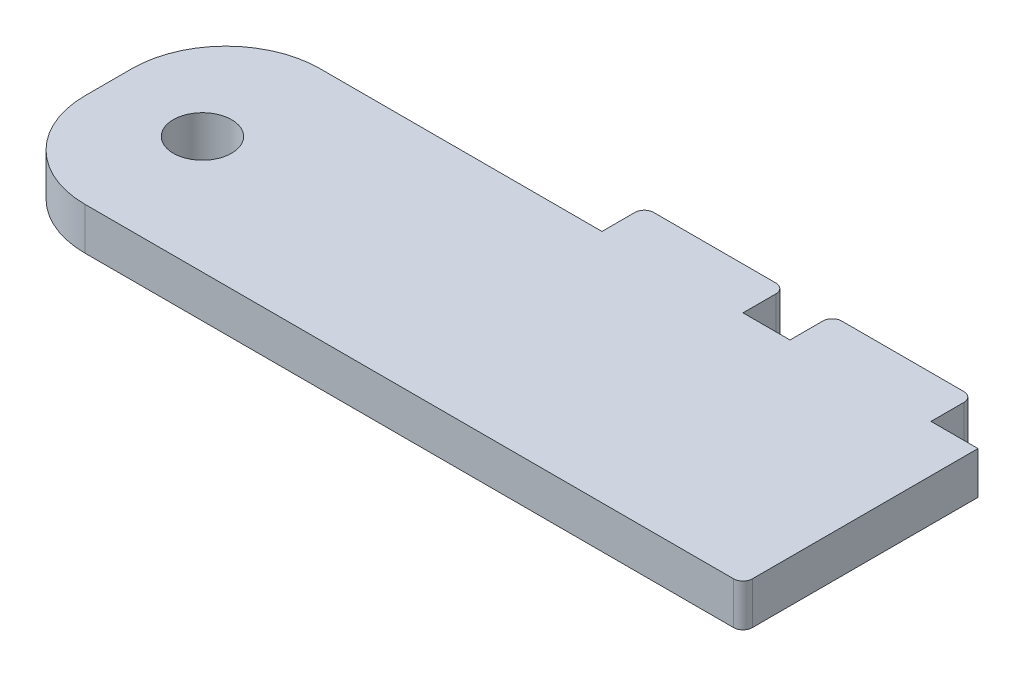
ISO-10303-21;
HEADER;
FILE_DESCRIPTION(('STEP AP214'),'2;1');
FILE_NAME('part.step','',(''),(''),'','','');
FILE_SCHEMA(('AUTOMOTIVE_DESIGN { 1 0 10303 214 1 1 1 1 }'));
ENDSEC;
DATA;
#1=APPLICATION_CONTEXT('core data for automotive mechanical design processes');
#2=APPLICATION_PROTOCOL_DEFINITION('international standard','automotive_design',2000,#1);
#3=PRODUCT_CONTEXT('',#1,'mechanical');
#4=PRODUCT('Part','Part','',(#3));
#5=PRODUCT_RELATED_PRODUCT_CATEGORY('part','',(#4));
#6=PRODUCT_DEFINITION_FORMATION('','',#4);
#7=PRODUCT_DEFINITION_CONTEXT('part definition',#1,'design');
#8=PRODUCT_DEFINITION('design','',#6,#7);
#9=PRODUCT_DEFINITION_SHAPE('','',#8);
#10=(LENGTH_UNIT() NAMED_UNIT(*) SI_UNIT(.MILLI.,.METRE.));
#11=(NAMED_UNIT(*) PLANE_ANGLE_UNIT() SI_UNIT($,.RADIAN.));
#12=(NAMED_UNIT(*) SI_UNIT($,.STERADIAN.) SOLID_ANGLE_UNIT());
#13=UNCERTAINTY_MEASURE_WITH_UNIT(LENGTH_MEASURE(1.E-05),#10,'distance_accuracy_value','');
#14=(GEOMETRIC_REPRESENTATION_CONTEXT(3) GLOBAL_UNCERTAINTY_ASSIGNED_CONTEXT((#13)) GLOBAL_UNIT_ASSIGNED_CONTEXT((#10,
#11,#12)) REPRESENTATION_CONTEXT('',''));
#15=CARTESIAN_POINT('',(0.,0.,0.));
#16=DIRECTION('',(0.,0.,1.));
#17=DIRECTION('',(1.,0.,0.));
#18=AXIS2_PLACEMENT_3D('',#15,#16,#17);
#19=CARTESIAN_POINT('',(39.,4.5,11.5));
#20=DIRECTION('',(0.,1.,0.));
#21=DIRECTION('',(0.,0.,1.));
#22=AXIS2_PLACEMENT_3D('',#19,#20,#21);
#23=PLANE('',#22);
#24=DIRECTION('',(-1.,0.,0.));
#25=VECTOR('',#24,1.);
#26=CARTESIAN_POINT('',(35.,4.5,-12.5));
#27=LINE('',#26,#25);
#28=CARTESIAN_POINT('',(40.,4.5,-12.5));
#29=VERTEX_POINT('',#28);
#30=CARTESIAN_POINT('',(35.,4.5,-12.5));
#31=VERTEX_POINT('',#30);
#32=EDGE_CURVE('E233',#29,#31,#27,.T.);
#33=ORIENTED_EDGE('',*,*,#32,.T.);
#34=DIRECTION('',(0.,0.,-1.));
#35=VECTOR('',#34,1.);
#36=CARTESIAN_POINT('',(35.,4.5,-12.5));
#37=LINE('',#36,#35);
#38=CARTESIAN_POINT('',(35.,4.5,-16.));
#39=VERTEX_POINT('',#38);
#40=EDGE_CURVE('E126',#31,#39,#37,.T.);
#41=ORIENTED_EDGE('',*,*,#40,.T.);
#42=CARTESIAN_POINT('',(34.,4.5,-16.));
#43=DIRECTION('',(0.,1.,0.));
#44=DIRECTION('',(0.,0.,-1.));
#45=AXIS2_PLACEMENT_3D('',#42,#43,#44);
#46=CIRCLE('',#45,1.);
#47=CARTESIAN_POINT('',(34.,4.5,-17.));
#48=VERTEX_POINT('',#47);
#49=EDGE_CURVE('E281',#39,#48,#46,.T.);
#50=ORIENTED_EDGE('',*,*,#49,.T.);
#51=DIRECTION('',(-1.,0.,0.));
#52=VECTOR('',#51,1.);
#53=CARTESIAN_POINT('',(21.,4.5,-17.));
#54=LINE('',#53,#52);
#55=CARTESIAN_POINT('',(21.,4.5,-17.));
#56=VERTEX_POINT('',#55);
#57=EDGE_CURVE('E300',#48,#56,#54,.T.);
#58=ORIENTED_EDGE('',*,*,#57,.T.);
#59=CARTESIAN_POINT('',(21.,4.5,-16.));
#60=DIRECTION('',(0.,1.,0.));
#61=DIRECTION('',(0.,0.,-1.));
#62=AXIS2_PLACEMENT_3D('',#59,#60,#61);
#63=CIRCLE('',#62,1.);
#64=CARTESIAN_POINT('',(20.,4.5,-16.));
#65=VERTEX_POINT('',#64);
#66=EDGE_CURVE('E297',#56,#65,#63,.T.);
#67=ORIENTED_EDGE('',*,*,#66,.T.);
#68=DIRECTION('',(0.,0.,1.));
#69=VECTOR('',#68,1.);
#70=CARTESIAN_POINT('',(20.,4.5,-12.5));
#71=LINE('',#70,#69);
#72=CARTESIAN_POINT('',(20.,4.5,-12.5));
#73=VERTEX_POINT('',#72);
#74=EDGE_CURVE('E299',#65,#73,#71,.T.);
#75=ORIENTED_EDGE('',*,*,#74,.T.);
#76=DIRECTION('',(-1.,0.,0.));
#77=VECTOR('',#76,1.);
#78=CARTESIAN_POINT('',(15.,4.5,-12.5));
#79=LINE('',#78,#77);
#80=CARTESIAN_POINT('',(15.,4.5,-12.5));
#81=VERTEX_POINT('',#80);
#82=EDGE_CURVE('E302',#73,#81,#79,.T.);
#83=ORIENTED_EDGE('',*,*,#82,.T.);
#84=DIRECTION('',(0.,0.,-1.));
#85=VECTOR('',#84,1.);
#86=CARTESIAN_POINT('',(15.,4.5,-12.5));
#87=LINE('',#86,#85);
#88=CARTESIAN_POINT('',(15.,4.5,-16.));
#89=VERTEX_POINT('',#88);
#90=EDGE_CURVE('E308',#81,#89,#87,.T.);
#91=ORIENTED_EDGE('',*,*,#90,.T.);
#92=CARTESIAN_POINT('',(14.,4.5,-16.));
#93=DIRECTION('',(0.,1.,0.));
#94=DIRECTION('',(0.,0.,-1.));
#95=AXIS2_PLACEMENT_3D('',#92,#93,#94);
#96=CIRCLE('',#95,1.);
#97=CARTESIAN_POINT('',(14.,4.5,-17.));
#98=VERTEX_POINT('',#97);
#99=EDGE_CURVE('E310',#89,#98,#96,.T.);
#100=ORIENTED_EDGE('',*,*,#99,.T.);
#101=DIRECTION('',(-1.,0.,0.));
#102=VECTOR('',#101,1.);
#103=CARTESIAN_POINT('',(0.999999999999993,4.5,-17.));
#104=LINE('',#103,#102);
#105=CARTESIAN_POINT('',(0.999999999999993,4.5,-17.));
#106=VERTEX_POINT('',#105);
#107=EDGE_CURVE('E312',#98,#106,#104,.T.);
#108=ORIENTED_EDGE('',*,*,#107,.T.);
#109=CARTESIAN_POINT('',(0.999999999999993,4.5,-16.));
#110=DIRECTION('',(0.,1.,0.));
#111=DIRECTION('',(0.,0.,-1.));
#112=AXIS2_PLACEMENT_3D('',#109,#110,#111);
#113=CIRCLE('',#112,1.);
#114=CARTESIAN_POINT('',(0.,4.5,-16.));
#115=VERTEX_POINT('',#114);
#116=EDGE_CURVE('E314',#106,#115,#113,.T.);
#117=ORIENTED_EDGE('',*,*,#116,.T.);
#118=DIRECTION('',(0.,0.,1.));
#119=VECTOR('',#118,1.);
#120=CARTESIAN_POINT('',(0.,4.5,-12.5));
#121=LINE('',#120,#119);
#122=CARTESIAN_POINT('',(0.,4.5,-12.5));
#123=VERTEX_POINT('',#122);
#124=EDGE_CURVE('E316',#115,#123,#121,.T.);
#125=ORIENTED_EDGE('',*,*,#124,.T.);
#126=DIRECTION('',(-1.,0.,0.));
#127=VECTOR('',#126,1.);
#128=CARTESIAN_POINT('',(-30.,4.5,-12.5));
#129=LINE('',#128,#127);
#130=CARTESIAN_POINT('',(-30.,4.5,-12.5));
#131=VERTEX_POINT('',#130);
#132=EDGE_CURVE('E318',#123,#131,#129,.T.);
#133=ORIENTED_EDGE('',*,*,#132,.T.);
#134=CARTESIAN_POINT('',(-30.,4.5,-2.5));
#135=DIRECTION('',(0.,1.,0.));
#136=DIRECTION('',(0.,0.,-1.));
#137=AXIS2_PLACEMENT_3D('',#134,#135,#136);
#138=CIRCLE('',#137,10.);
#139=CARTESIAN_POINT('',(-40.,4.5,-2.5));
#140=VERTEX_POINT('',#139);
#141=EDGE_CURVE('E320',#131,#140,#138,.T.);
#142=ORIENTED_EDGE('',*,*,#141,.T.);
#143=DIRECTION('',(0.,0.,1.));
#144=VECTOR('',#143,1.);
#145=CARTESIAN_POINT('',(-40.,4.5,2.5));
#146=LINE('',#145,#144);
#147=CARTESIAN_POINT('',(-40.,4.5,2.5));
#148=VERTEX_POINT('',#147);
#149=EDGE_CURVE('E322',#140,#148,#146,.T.);
#150=ORIENTED_EDGE('',*,*,#149,.T.);
#151=CARTESIAN_POINT('',(-30.,4.5,2.5));
#152=DIRECTION('',(0.,1.,0.));
#153=DIRECTION('',(0.,0.,-1.));
#154=AXIS2_PLACEMENT_3D('',#151,#152,#153);
#155=CIRCLE('',#154,10.);
#156=CARTESIAN_POINT('',(-30.,4.5,12.5));
#157=VERTEX_POINT('',#156);
#158=EDGE_CURVE('E178',#148,#157,#155,.T.);
#159=ORIENTED_EDGE('',*,*,#158,.T.);
#160=DIRECTION('',(1.,0.,0.));
#161=VECTOR('',#160,1.);
#162=CARTESIAN_POINT('',(-30.,4.5,12.5));
#163=LINE('',#162,#161);
#164=CARTESIAN_POINT('',(39.,4.5,12.5));
#165=VERTEX_POINT('',#164);
#166=EDGE_CURVE('E172',#157,#165,#163,.T.);
#167=ORIENTED_EDGE('',*,*,#166,.T.);
#168=CARTESIAN_POINT('',(39.,4.5,11.5));
#169=DIRECTION('',(0.,1.,0.));
#170=DIRECTION('',(0.,0.,1.));
#171=AXIS2_PLACEMENT_3D('',#168,#169,#170);
#172=CIRCLE('',#171,1.);
#173=CARTESIAN_POINT('',(40.,4.5,11.5));
#174=VERTEX_POINT('',#173);
#175=EDGE_CURVE('E176',#165,#174,#172,.T.);
#176=ORIENTED_EDGE('',*,*,#175,.T.);
#177=DIRECTION('',(0.,0.,-1.));
#178=VECTOR('',#177,1.);
#179=CARTESIAN_POINT('',(40.,4.5,11.5));
#180=LINE('',#179,#178);
#181=EDGE_CURVE('E50',#174,#29,#180,.T.);
#182=ORIENTED_EDGE('',*,*,#181,.T.);
#183=EDGE_LOOP('',(#33,#41,#50,#58,#67,#75,#83,#91,#100,#108,#117,#125,#133,#142,#150,#159,#167,
#176,#182));
#184=FACE_BOUND('',#183,.T.);
#185=CARTESIAN_POINT('',(-30.,4.5,0.));
#186=DIRECTION('',(0.,1.,0.));
#187=DIRECTION('',(0.,0.,1.));
#188=AXIS2_PLACEMENT_3D('',#185,#186,#187);
#189=CIRCLE('',#188,3.1);
#190=CARTESIAN_POINT('',(-30.,4.5,3.1));
#191=VERTEX_POINT('',#190);
#192=EDGE_CURVE('E200',#191,#191,#189,.T.);
#193=ORIENTED_EDGE('',*,*,#192,.F.);
#194=EDGE_LOOP('',(#193));
#195=FACE_BOUND('',#194,.T.);
#196=ADVANCED_FACE('F33',(#184,#195),#23,.T.);
#197=CARTESIAN_POINT('',(39.,0.,11.5));
#198=DIRECTION('',(0.,1.,0.));
#199=DIRECTION('',(0.,0.,1.));
#200=AXIS2_PLACEMENT_3D('',#197,#198,#199);
#201=PLANE('',#200);
#202=DIRECTION('',(-1.,0.,0.));
#203=VECTOR('',#202,1.);
#204=CARTESIAN_POINT('',(35.,0.,-12.5));
#205=LINE('',#204,#203);
#206=CARTESIAN_POINT('',(40.,0.,-12.5));
#207=VERTEX_POINT('',#206);
#208=CARTESIAN_POINT('',(35.,0.,-12.5));
#209=VERTEX_POINT('',#208);
#210=EDGE_CURVE('E196',#207,#209,#205,.T.);
#211=ORIENTED_EDGE('',*,*,#210,.F.);
#212=DIRECTION('',(0.,0.,-1.));
#213=VECTOR('',#212,1.);
#214=CARTESIAN_POINT('',(40.,0.,11.5));
#215=LINE('',#214,#213);
#216=CARTESIAN_POINT('',(40.,0.,11.5));
#217=VERTEX_POINT('',#216);
#218=EDGE_CURVE('E118',#217,#207,#215,.T.);
#219=ORIENTED_EDGE('',*,*,#218,.F.);
#220=CARTESIAN_POINT('',(39.,0.,11.5));
#221=DIRECTION('',(0.,1.,0.));
#222=DIRECTION('',(0.,0.,1.));
#223=AXIS2_PLACEMENT_3D('',#220,#221,#222);
#224=CIRCLE('',#223,1.);
#225=CARTESIAN_POINT('',(39.,0.,12.5));
#226=VERTEX_POINT('',#225);
#227=EDGE_CURVE('E112',#226,#217,#224,.T.);
#228=ORIENTED_EDGE('',*,*,#227,.F.);
#229=DIRECTION('',(1.,0.,0.));
#230=VECTOR('',#229,1.);
#231=CARTESIAN_POINT('',(-30.,0.,12.5));
#232=LINE('',#231,#230);
#233=CARTESIAN_POINT('',(-30.,0.,12.5));
#234=VERTEX_POINT('',#233);
#235=EDGE_CURVE('E186',#234,#226,#232,.T.);
#236=ORIENTED_EDGE('',*,*,#235,.F.);
#237=CARTESIAN_POINT('',(-30.,0.,2.5));
#238=DIRECTION('',(0.,1.,0.));
#239=DIRECTION('',(0.,0.,-1.));
#240=AXIS2_PLACEMENT_3D('',#237,#238,#239);
#241=CIRCLE('',#240,10.);
#242=CARTESIAN_POINT('',(-40.,0.,2.5));
#243=VERTEX_POINT('',#242);
#244=EDGE_CURVE('E228',#243,#234,#241,.T.);
#245=ORIENTED_EDGE('',*,*,#244,.F.);
#246=DIRECTION('',(0.,0.,1.));
#247=VECTOR('',#246,1.);
#248=CARTESIAN_POINT('',(-40.,0.,2.5));
#249=LINE('',#248,#247);
#250=CARTESIAN_POINT('',(-40.,0.,-2.5));
#251=VERTEX_POINT('',#250);
#252=EDGE_CURVE('E226',#251,#243,#249,.T.);
#253=ORIENTED_EDGE('',*,*,#252,.F.);
#254=CARTESIAN_POINT('',(-30.,0.,-2.5));
#255=DIRECTION('',(0.,1.,0.));
#256=DIRECTION('',(0.,0.,-1.));
#257=AXIS2_PLACEMENT_3D('',#254,#255,#256);
#258=CIRCLE('',#257,10.);
#259=CARTESIAN_POINT('',(-30.,0.,-12.5));
#260=VERTEX_POINT('',#259);
#261=EDGE_CURVE('E224',#260,#251,#258,.T.);
#262=ORIENTED_EDGE('',*,*,#261,.F.);
#263=DIRECTION('',(-1.,0.,0.));
#264=VECTOR('',#263,1.);
#265=CARTESIAN_POINT('',(-30.,0.,-12.5));
#266=LINE('',#265,#264);
#267=CARTESIAN_POINT('',(0.,0.,-12.5));
#268=VERTEX_POINT('',#267);
#269=EDGE_CURVE('E222',#268,#260,#266,.T.);
#270=ORIENTED_EDGE('',*,*,#269,.F.);
#271=DIRECTION('',(0.,0.,1.));
#272=VECTOR('',#271,1.);
#273=CARTESIAN_POINT('',(0.,0.,-12.5));
#274=LINE('',#273,#272);
#275=CARTESIAN_POINT('',(0.,0.,-16.));
#276=VERTEX_POINT('',#275);
#277=EDGE_CURVE('E220',#276,#268,#274,.T.);
#278=ORIENTED_EDGE('',*,*,#277,.F.);
#279=CARTESIAN_POINT('',(0.999999999999993,0.,-16.));
#280=DIRECTION('',(0.,1.,0.));
#281=DIRECTION('',(0.,0.,-1.));
#282=AXIS2_PLACEMENT_3D('',#279,#280,#281);
#283=CIRCLE('',#282,1.);
#284=CARTESIAN_POINT('',(0.999999999999993,0.,-17.));
#285=VERTEX_POINT('',#284);
#286=EDGE_CURVE('E218',#285,#276,#283,.T.);
#287=ORIENTED_EDGE('',*,*,#286,.F.);
#288=DIRECTION('',(-1.,0.,0.));
#289=VECTOR('',#288,1.);
#290=CARTESIAN_POINT('',(0.999999999999993,0.,-17.));
#291=LINE('',#290,#289);
#292=CARTESIAN_POINT('',(14.,0.,-17.));
#293=VERTEX_POINT('',#292);
#294=EDGE_CURVE('E216',#293,#285,#291,.T.);
#295=ORIENTED_EDGE('',*,*,#294,.F.);
#296=CARTESIAN_POINT('',(14.,0.,-16.));
#297=DIRECTION('',(0.,1.,0.));
#298=DIRECTION('',(0.,0.,-1.));
#299=AXIS2_PLACEMENT_3D('',#296,#297,#298);
#300=CIRCLE('',#299,1.);
#301=CARTESIAN_POINT('',(15.,0.,-16.));
#302=VERTEX_POINT('',#301);
#303=EDGE_CURVE('E214',#302,#293,#300,.T.);
#304=ORIENTED_EDGE('',*,*,#303,.F.);
#305=DIRECTION('',(0.,0.,-1.));
#306=VECTOR('',#305,1.);
#307=CARTESIAN_POINT('',(15.,0.,-12.5));
#308=LINE('',#307,#306);
#309=CARTESIAN_POINT('',(15.,0.,-12.5));
#310=VERTEX_POINT('',#309);
#311=EDGE_CURVE('E212',#310,#302,#308,.T.);
#312=ORIENTED_EDGE('',*,*,#311,.F.);
#313=DIRECTION('',(-1.,0.,0.));
#314=VECTOR('',#313,1.);
#315=CARTESIAN_POINT('',(15.,0.,-12.5));
#316=LINE('',#315,#314);
#317=CARTESIAN_POINT('',(20.,0.,-12.5));
#318=VERTEX_POINT('',#317);
#319=EDGE_CURVE('E210',#318,#310,#316,.T.);
#320=ORIENTED_EDGE('',*,*,#319,.F.);
#321=DIRECTION('',(0.,0.,1.));
#322=VECTOR('',#321,1.);
#323=CARTESIAN_POINT('',(20.,0.,-12.5));
#324=LINE('',#323,#322);
#325=CARTESIAN_POINT('',(20.,0.,-16.));
#326=VERTEX_POINT('',#325);
#327=EDGE_CURVE('E208',#326,#318,#324,.T.);
#328=ORIENTED_EDGE('',*,*,#327,.F.);
#329=CARTESIAN_POINT('',(21.,0.,-16.));
#330=DIRECTION('',(0.,1.,0.));
#331=DIRECTION('',(0.,0.,-1.));
#332=AXIS2_PLACEMENT_3D('',#329,#330,#331);
#333=CIRCLE('',#332,1.);
#334=CARTESIAN_POINT('',(21.,0.,-17.));
#335=VERTEX_POINT('',#334);
#336=EDGE_CURVE('E206',#335,#326,#333,.T.);
#337=ORIENTED_EDGE('',*,*,#336,.F.);
#338=DIRECTION('',(-1.,0.,0.));
#339=VECTOR('',#338,1.);
#340=CARTESIAN_POINT('',(21.,0.,-17.));
#341=LINE('',#340,#339);
#342=CARTESIAN_POINT('',(34.,0.,-17.));
#343=VERTEX_POINT('',#342);
#344=EDGE_CURVE('E204',#343,#335,#341,.T.);
#345=ORIENTED_EDGE('',*,*,#344,.F.);
#346=CARTESIAN_POINT('',(34.,0.,-16.));
#347=DIRECTION('',(0.,1.,0.));
#348=DIRECTION('',(0.,0.,-1.));
#349=AXIS2_PLACEMENT_3D('',#346,#347,#348);
#350=CIRCLE('',#349,1.);
#351=CARTESIAN_POINT('',(35.,0.,-16.));
#352=VERTEX_POINT('',#351);
#353=EDGE_CURVE('E202',#352,#343,#350,.T.);
#354=ORIENTED_EDGE('',*,*,#353,.F.);
#355=DIRECTION('',(0.,0.,-1.));
#356=VECTOR('',#355,1.);
#357=CARTESIAN_POINT('',(35.,0.,-12.5));
#358=LINE('',#357,#356);
#359=EDGE_CURVE('E199',#209,#352,#358,.T.);
#360=ORIENTED_EDGE('',*,*,#359,.F.);
#361=EDGE_LOOP('',(#211,#219,#228,#236,#245,#253,#262,#270,#278,#287,#295,#304,#312,#320,#328,
#337,#345,#354,#360));
#362=FACE_BOUND('',#361,.T.);
#363=CARTESIAN_POINT('',(-30.,0.,0.));
#364=DIRECTION('',(0.,1.,0.));
#365=DIRECTION('',(0.,0.,1.));
#366=AXIS2_PLACEMENT_3D('',#363,#364,#365);
#367=CIRCLE('',#366,3.1);
#368=CARTESIAN_POINT('',(-30.,0.,3.1));
#369=VERTEX_POINT('',#368);
#370=EDGE_CURVE('E560',#369,#369,#367,.T.);
#371=ORIENTED_EDGE('',*,*,#370,.T.);
#372=EDGE_LOOP('',(#371));
#373=FACE_BOUND('',#372,.T.);
#374=ADVANCED_FACE('F285',(#362,#373),#201,.F.);
#375=CARTESIAN_POINT('',(35.,4.5,-12.5));
#376=DIRECTION('',(0.,0.,1.));
#377=DIRECTION('',(1.,0.,0.));
#378=AXIS2_PLACEMENT_3D('',#375,#376,#377);
#379=PLANE('',#378);
#380=ORIENTED_EDGE('',*,*,#210,.T.);
#381=DIRECTION('',(0.,-1.,0.));
#382=VECTOR('',#381,1.);
#383=CARTESIAN_POINT('',(35.,4.5,-12.5));
#384=LINE('',#383,#382);
#385=EDGE_CURVE('E11',#31,#209,#384,.T.);
#386=ORIENTED_EDGE('',*,*,#385,.F.);
#387=ORIENTED_EDGE('',*,*,#32,.F.);
#388=DIRECTION('',(0.,-1.,0.));
#389=VECTOR('',#388,1.);
#390=CARTESIAN_POINT('',(40.,4.5,-12.5));
#391=LINE('',#390,#389);
#392=EDGE_CURVE('E192',#29,#207,#391,.T.);
#393=ORIENTED_EDGE('',*,*,#392,.T.);
#394=EDGE_LOOP('',(#380,#386,#387,#393));
#395=FACE_BOUND('',#394,.T.);
#396=ADVANCED_FACE('F35',(#395),#379,.F.);
#397=CARTESIAN_POINT('',(35.,4.5,-12.5));
#398=DIRECTION('',(-1.,0.,0.));
#399=DIRECTION('',(0.,0.,1.));
#400=AXIS2_PLACEMENT_3D('',#397,#398,#399);
#401=PLANE('',#400);
#402=ORIENTED_EDGE('',*,*,#359,.T.);
#403=DIRECTION('',(0.,-1.,0.));
#404=VECTOR('',#403,1.);
#405=CARTESIAN_POINT('',(35.,4.5,-16.));
#406=LINE('',#405,#404);
#407=EDGE_CURVE('E42',#39,#352,#406,.T.);
#408=ORIENTED_EDGE('',*,*,#407,.F.);
#409=ORIENTED_EDGE('',*,*,#40,.F.);
#410=ORIENTED_EDGE('',*,*,#385,.T.);
#411=EDGE_LOOP('',(#402,#408,#409,#410));
#412=FACE_BOUND('',#411,.T.);
#413=ADVANCED_FACE('F356',(#412),#401,.F.);
#414=CARTESIAN_POINT('',(34.,4.5,-16.));
#415=DIRECTION('',(0.,-1.,0.));
#416=DIRECTION('',(0.,0.,-1.));
#417=AXIS2_PLACEMENT_3D('',#414,#415,#416);
#418=CYLINDRICAL_SURFACE('',#417,1.);
#419=ORIENTED_EDGE('',*,*,#353,.T.);
#420=DIRECTION('',(0.,-1.,0.));
#421=VECTOR('',#420,1.);
#422=CARTESIAN_POINT('',(34.,4.5,-17.));
#423=LINE('',#422,#421);
#424=EDGE_CURVE('E273',#48,#343,#423,.T.);
#425=ORIENTED_EDGE('',*,*,#424,.F.);
#426=ORIENTED_EDGE('',*,*,#49,.F.);
#427=ORIENTED_EDGE('',*,*,#407,.T.);
#428=EDGE_LOOP('',(#419,#425,#426,#427));
#429=FACE_BOUND('',#428,.T.);
#430=ADVANCED_FACE('F279',(#429),#418,.T.);
#431=CARTESIAN_POINT('',(21.,4.5,-17.));
#432=DIRECTION('',(0.,0.,1.));
#433=DIRECTION('',(1.,0.,0.));
#434=AXIS2_PLACEMENT_3D('',#431,#432,#433);
#435=PLANE('',#434);
#436=ORIENTED_EDGE('',*,*,#344,.T.);
#437=DIRECTION('',(0.,-1.,0.));
#438=VECTOR('',#437,1.);
#439=CARTESIAN_POINT('',(21.,4.5,-17.));
#440=LINE('',#439,#438);
#441=EDGE_CURVE('E270',#56,#335,#440,.T.);
#442=ORIENTED_EDGE('',*,*,#441,.F.);
#443=ORIENTED_EDGE('',*,*,#57,.F.);
#444=ORIENTED_EDGE('',*,*,#424,.T.);
#445=EDGE_LOOP('',(#436,#442,#443,#444));
#446=FACE_BOUND('',#445,.T.);
#447=ADVANCED_FACE('F291',(#446),#435,.F.);
#448=CARTESIAN_POINT('',(21.,4.5,-16.));
#449=DIRECTION('',(0.,-1.,0.));
#450=DIRECTION('',(0.,0.,-1.));
#451=AXIS2_PLACEMENT_3D('',#448,#449,#450);
#452=CYLINDRICAL_SURFACE('',#451,1.);
#453=ORIENTED_EDGE('',*,*,#336,.T.);
#454=DIRECTION('',(0.,-1.,0.));
#455=VECTOR('',#454,1.);
#456=CARTESIAN_POINT('',(20.,4.5,-16.));
#457=LINE('',#456,#455);
#458=EDGE_CURVE('E267',#65,#326,#457,.T.);
#459=ORIENTED_EDGE('',*,*,#458,.F.);
#460=ORIENTED_EDGE('',*,*,#66,.F.);
#461=ORIENTED_EDGE('',*,*,#441,.T.);
#462=EDGE_LOOP('',(#453,#459,#460,#461));
#463=FACE_BOUND('',#462,.T.);
#464=ADVANCED_FACE('F295',(#463),#452,.T.);
#465=CARTESIAN_POINT('',(20.,4.5,-12.5));
#466=DIRECTION('',(1.,0.,0.));
#467=DIRECTION('',(0.,0.,-1.));
#468=AXIS2_PLACEMENT_3D('',#465,#466,#467);
#469=PLANE('',#468);
#470=ORIENTED_EDGE('',*,*,#327,.T.);
#471=DIRECTION('',(0.,-1.,0.));
#472=VECTOR('',#471,1.);
#473=CARTESIAN_POINT('',(20.,4.5,-12.5));
#474=LINE('',#473,#472);
#475=EDGE_CURVE('E264',#73,#318,#474,.T.);
#476=ORIENTED_EDGE('',*,*,#475,.F.);
#477=ORIENTED_EDGE('',*,*,#74,.F.);
#478=ORIENTED_EDGE('',*,*,#458,.T.);
#479=EDGE_LOOP('',(#470,#476,#477,#478));
#480=FACE_BOUND('',#479,.T.);
#481=ADVANCED_FACE('F369',(#480),#469,.F.);
#482=CARTESIAN_POINT('',(15.,4.5,-12.5));
#483=DIRECTION('',(0.,0.,1.));
#484=DIRECTION('',(1.,0.,0.));
#485=AXIS2_PLACEMENT_3D('',#482,#483,#484);
#486=PLANE('',#485);
#487=ORIENTED_EDGE('',*,*,#319,.T.);
#488=DIRECTION('',(0.,-1.,0.));
#489=VECTOR('',#488,1.);
#490=CARTESIAN_POINT('',(15.,4.5,-12.5));
#491=LINE('',#490,#489);
#492=EDGE_CURVE('E261',#81,#310,#491,.T.);
#493=ORIENTED_EDGE('',*,*,#492,.F.);
#494=ORIENTED_EDGE('',*,*,#82,.F.);
#495=ORIENTED_EDGE('',*,*,#475,.T.);
#496=EDGE_LOOP('',(#487,#493,#494,#495));
#497=FACE_BOUND('',#496,.T.);
#498=ADVANCED_FACE('F372',(#497),#486,.F.);
#499=CARTESIAN_POINT('',(15.,4.5,-12.5));
#500=DIRECTION('',(-1.,0.,0.));
#501=DIRECTION('',(0.,0.,1.));
#502=AXIS2_PLACEMENT_3D('',#499,#500,#501);
#503=PLANE('',#502);
#504=ORIENTED_EDGE('',*,*,#311,.T.);
#505=DIRECTION('',(0.,-1.,0.));
#506=VECTOR('',#505,1.);
#507=CARTESIAN_POINT('',(15.,4.5,-16.));
#508=LINE('',#507,#506);
#509=EDGE_CURVE('E258',#89,#302,#508,.T.);
#510=ORIENTED_EDGE('',*,*,#509,.F.);
#511=ORIENTED_EDGE('',*,*,#90,.F.);
#512=ORIENTED_EDGE('',*,*,#492,.T.);
#513=EDGE_LOOP('',(#504,#510,#511,#512));
#514=FACE_BOUND('',#513,.T.);
#515=ADVANCED_FACE('F376',(#514),#503,.F.);
#516=CARTESIAN_POINT('',(14.,4.5,-16.));
#517=DIRECTION('',(0.,-1.,0.));
#518=DIRECTION('',(0.,0.,-1.));
#519=AXIS2_PLACEMENT_3D('',#516,#517,#518);
#520=CYLINDRICAL_SURFACE('',#519,1.);
#521=ORIENTED_EDGE('',*,*,#303,.T.);
#522=DIRECTION('',(0.,-1.,0.));
#523=VECTOR('',#522,1.);
#524=CARTESIAN_POINT('',(14.,4.5,-17.));
#525=LINE('',#524,#523);
#526=EDGE_CURVE('E255',#98,#293,#525,.T.);
#527=ORIENTED_EDGE('',*,*,#526,.F.);
#528=ORIENTED_EDGE('',*,*,#99,.F.);
#529=ORIENTED_EDGE('',*,*,#509,.T.);
#530=EDGE_LOOP('',(#521,#527,#528,#529));
#531=FACE_BOUND('',#530,.T.);
#532=ADVANCED_FACE('F380',(#531),#520,.T.);
#533=CARTESIAN_POINT('',(0.999999999999993,4.5,-17.));
#534=DIRECTION('',(0.,0.,1.));
#535=DIRECTION('',(1.,0.,0.));
#536=AXIS2_PLACEMENT_3D('',#533,#534,#535);
#537=PLANE('',#536);
#538=ORIENTED_EDGE('',*,*,#294,.T.);
#539=DIRECTION('',(0.,-1.,0.));
#540=VECTOR('',#539,1.);
#541=CARTESIAN_POINT('',(0.999999999999993,4.5,-17.));
#542=LINE('',#541,#540);
#543=EDGE_CURVE('E252',#106,#285,#542,.T.);
#544=ORIENTED_EDGE('',*,*,#543,.F.);
#545=ORIENTED_EDGE('',*,*,#107,.F.);
#546=ORIENTED_EDGE('',*,*,#526,.T.);
#547=EDGE_LOOP('',(#538,#544,#545,#546));
#548=FACE_BOUND('',#547,.T.);
#549=ADVANCED_FACE('F384',(#548),#537,.F.);
#550=CARTESIAN_POINT('',(0.999999999999993,4.5,-16.));
#551=DIRECTION('',(0.,-1.,0.));
#552=DIRECTION('',(0.,0.,-1.));
#553=AXIS2_PLACEMENT_3D('',#550,#551,#552);
#554=CYLINDRICAL_SURFACE('',#553,1.);
#555=ORIENTED_EDGE('',*,*,#286,.T.);
#556=DIRECTION('',(0.,-1.,0.));
#557=VECTOR('',#556,1.);
#558=CARTESIAN_POINT('',(0.,4.5,-16.));
#559=LINE('',#558,#557);
#560=EDGE_CURVE('E249',#115,#276,#559,.T.);
#561=ORIENTED_EDGE('',*,*,#560,.F.);
#562=ORIENTED_EDGE('',*,*,#116,.F.);
#563=ORIENTED_EDGE('',*,*,#543,.T.);
#564=EDGE_LOOP('',(#555,#561,#562,#563));
#565=FACE_BOUND('',#564,.T.);
#566=ADVANCED_FACE('F388',(#565),#554,.T.);
#567=CARTESIAN_POINT('',(0.,4.5,-12.5));
#568=DIRECTION('',(1.,0.,0.));
#569=DIRECTION('',(0.,0.,-1.));
#570=AXIS2_PLACEMENT_3D('',#567,#568,#569);
#571=PLANE('',#570);
#572=ORIENTED_EDGE('',*,*,#277,.T.);
#573=DIRECTION('',(0.,-1.,0.));
#574=VECTOR('',#573,1.);
#575=CARTESIAN_POINT('',(0.,4.5,-12.5));
#576=LINE('',#575,#574);
#577=EDGE_CURVE('E246',#123,#268,#576,.T.);
#578=ORIENTED_EDGE('',*,*,#577,.F.);
#579=ORIENTED_EDGE('',*,*,#124,.F.);
#580=ORIENTED_EDGE('',*,*,#560,.T.);
#581=EDGE_LOOP('',(#572,#578,#579,#580));
#582=FACE_BOUND('',#581,.T.);
#583=ADVANCED_FACE('F392',(#582),#571,.F.);
#584=CARTESIAN_POINT('',(-30.,4.5,-12.5));
#585=DIRECTION('',(0.,0.,1.));
#586=DIRECTION('',(1.,0.,0.));
#587=AXIS2_PLACEMENT_3D('',#584,#585,#586);
#588=PLANE('',#587);
#589=ORIENTED_EDGE('',*,*,#269,.T.);
#590=DIRECTION('',(0.,-1.,0.));
#591=VECTOR('',#590,1.);
#592=CARTESIAN_POINT('',(-30.,4.5,-12.5));
#593=LINE('',#592,#591);
#594=EDGE_CURVE('E243',#131,#260,#593,.T.);
#595=ORIENTED_EDGE('',*,*,#594,.F.);
#596=ORIENTED_EDGE('',*,*,#132,.F.);
#597=ORIENTED_EDGE('',*,*,#577,.T.);
#598=EDGE_LOOP('',(#589,#595,#596,#597));
#599=FACE_BOUND('',#598,.T.);
#600=ADVANCED_FACE('F396',(#599),#588,.F.);
#601=CARTESIAN_POINT('',(-30.,4.5,-2.5));
#602=DIRECTION('',(0.,-1.,0.));
#603=DIRECTION('',(0.,0.,-1.));
#604=AXIS2_PLACEMENT_3D('',#601,#602,#603);
#605=CYLINDRICAL_SURFACE('',#604,10.);
#606=ORIENTED_EDGE('',*,*,#261,.T.);
#607=DIRECTION('',(0.,-1.,0.));
#608=VECTOR('',#607,1.);
#609=CARTESIAN_POINT('',(-40.,4.5,-2.5));
#610=LINE('',#609,#608);
#611=EDGE_CURVE('E240',#140,#251,#610,.T.);
#612=ORIENTED_EDGE('',*,*,#611,.F.);
#613=ORIENTED_EDGE('',*,*,#141,.F.);
#614=ORIENTED_EDGE('',*,*,#594,.T.);
#615=EDGE_LOOP('',(#606,#612,#613,#614));
#616=FACE_BOUND('',#615,.T.);
#617=ADVANCED_FACE('F400',(#616),#605,.T.);
#618=CARTESIAN_POINT('',(-40.,4.5,2.5));
#619=DIRECTION('',(1.,0.,0.));
#620=DIRECTION('',(0.,0.,-1.));
#621=AXIS2_PLACEMENT_3D('',#618,#619,#620);
#622=PLANE('',#621);
#623=ORIENTED_EDGE('',*,*,#252,.T.);
#624=DIRECTION('',(0.,-1.,0.));
#625=VECTOR('',#624,1.);
#626=CARTESIAN_POINT('',(-40.,4.5,2.5));
#627=LINE('',#626,#625);
#628=EDGE_CURVE('E237',#148,#243,#627,.T.);
#629=ORIENTED_EDGE('',*,*,#628,.F.);
#630=ORIENTED_EDGE('',*,*,#149,.F.);
#631=ORIENTED_EDGE('',*,*,#611,.T.);
#632=EDGE_LOOP('',(#623,#629,#630,#631));
#633=FACE_BOUND('',#632,.T.);
#634=ADVANCED_FACE('F328',(#633),#622,.F.);
#635=CARTESIAN_POINT('',(-30.,4.5,2.5));
#636=DIRECTION('',(0.,-1.,0.));
#637=DIRECTION('',(0.,0.,-1.));
#638=AXIS2_PLACEMENT_3D('',#635,#636,#637);
#639=CYLINDRICAL_SURFACE('',#638,10.);
#640=ORIENTED_EDGE('',*,*,#244,.T.);
#641=DIRECTION('',(0.,-1.,0.));
#642=VECTOR('',#641,1.);
#643=CARTESIAN_POINT('',(-30.,4.5,12.5));
#644=LINE('',#643,#642);
#645=EDGE_CURVE('E187',#157,#234,#644,.T.);
#646=ORIENTED_EDGE('',*,*,#645,.F.);
#647=ORIENTED_EDGE('',*,*,#158,.F.);
#648=ORIENTED_EDGE('',*,*,#628,.T.);
#649=EDGE_LOOP('',(#640,#646,#647,#648));
#650=FACE_BOUND('',#649,.T.);
#651=ADVANCED_FACE('F332',(#650),#639,.T.);
#652=CARTESIAN_POINT('',(-30.,4.5,12.5));
#653=DIRECTION('',(0.,0.,-1.));
#654=DIRECTION('',(-1.,0.,0.));
#655=AXIS2_PLACEMENT_3D('',#652,#653,#654);
#656=PLANE('',#655);
#657=ORIENTED_EDGE('',*,*,#235,.T.);
#658=DIRECTION('',(0.,-1.,0.));
#659=VECTOR('',#658,1.);
#660=CARTESIAN_POINT('',(39.,4.5,12.5));
#661=LINE('',#660,#659);
#662=EDGE_CURVE('E183',#165,#226,#661,.T.);
#663=ORIENTED_EDGE('',*,*,#662,.F.);
#664=ORIENTED_EDGE('',*,*,#166,.F.);
#665=ORIENTED_EDGE('',*,*,#645,.T.);
#666=EDGE_LOOP('',(#657,#663,#664,#665));
#667=FACE_BOUND('',#666,.T.);
#668=ADVANCED_FACE('F184',(#667),#656,.F.);
#669=CARTESIAN_POINT('',(39.,4.5,11.5));
#670=DIRECTION('',(0.,-1.,0.));
#671=DIRECTION('',(0.,0.,-1.));
#672=AXIS2_PLACEMENT_3D('',#669,#670,#671);
#673=CYLINDRICAL_SURFACE('',#672,1.);
#674=ORIENTED_EDGE('',*,*,#227,.T.);
#675=DIRECTION('',(0.,-1.,0.));
#676=VECTOR('',#675,1.);
#677=CARTESIAN_POINT('',(40.,4.5,11.5));
#678=LINE('',#677,#676);
#679=EDGE_CURVE('E188',#174,#217,#678,.T.);
#680=ORIENTED_EDGE('',*,*,#679,.F.);
#681=ORIENTED_EDGE('',*,*,#175,.F.);
#682=ORIENTED_EDGE('',*,*,#662,.T.);
#683=EDGE_LOOP('',(#674,#680,#681,#682));
#684=FACE_BOUND('',#683,.T.);
#685=ADVANCED_FACE('F190',(#684),#673,.T.);
#686=CARTESIAN_POINT('',(40.,4.5,11.5));
#687=DIRECTION('',(-1.,0.,0.));
#688=DIRECTION('',(0.,0.,1.));
#689=AXIS2_PLACEMENT_3D('',#686,#687,#688);
#690=PLANE('',#689);
#691=ORIENTED_EDGE('',*,*,#218,.T.);
#692=ORIENTED_EDGE('',*,*,#392,.F.);
#693=ORIENTED_EDGE('',*,*,#181,.F.);
#694=ORIENTED_EDGE('',*,*,#679,.T.);
#695=EDGE_LOOP('',(#691,#692,#693,#694));
#696=FACE_BOUND('',#695,.T.);
#697=ADVANCED_FACE('F336',(#696),#690,.F.);
#698=CARTESIAN_POINT('',(-30.,4.5,0.));
#699=DIRECTION('',(0.,-1.,0.));
#700=DIRECTION('',(0.,0.,-1.));
#701=AXIS2_PLACEMENT_3D('',#698,#699,#700);
#702=CYLINDRICAL_SURFACE('',#701,3.1);
#703=ORIENTED_EDGE('',*,*,#192,.T.);
#704=EDGE_LOOP('',(#703));
#705=FACE_BOUND('',#704,.T.);
#706=ORIENTED_EDGE('',*,*,#370,.F.);
#707=EDGE_LOOP('',(#706));
#708=FACE_BOUND('',#707,.T.);
#709=ADVANCED_FACE('F338',(#705,#708),#702,.F.);
#710=CLOSED_SHELL('',(#196,#374,#396,#413,#430,#447,#464,#481,#498,#515,#532,#549,#566,#583,
#600,#617,#634,#651,#668,#685,#697,#709));
#711=MANIFOLD_SOLID_BREP('B2',#710);
#712=ADVANCED_BREP_SHAPE_REPRESENTATION('',(#18,#711),#14);
#713=SHAPE_DEFINITION_REPRESENTATION(#9,#712);
ENDSEC;
END-ISO-10303-21;
